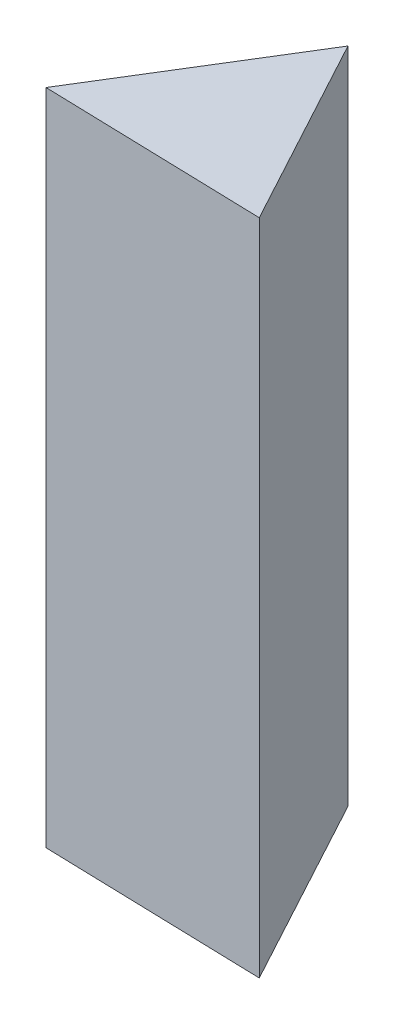
ISO-10303-21;
HEADER;
FILE_DESCRIPTION(('STEP AP214'),'2;1');
FILE_NAME('part.step','',(''),(''),'','','');
FILE_SCHEMA(('AUTOMOTIVE_DESIGN { 1 0 10303 214 1 1 1 1 }'));
ENDSEC;
DATA;
#1=APPLICATION_CONTEXT('core data for automotive mechanical design processes');
#2=APPLICATION_PROTOCOL_DEFINITION('international standard','automotive_design',2000,#1);
#3=PRODUCT_CONTEXT('',#1,'mechanical');
#4=PRODUCT('Part','Part','',(#3));
#5=PRODUCT_RELATED_PRODUCT_CATEGORY('part','',(#4));
#6=PRODUCT_DEFINITION_FORMATION('','',#4);
#7=PRODUCT_DEFINITION_CONTEXT('part definition',#1,'design');
#8=PRODUCT_DEFINITION('design','',#6,#7);
#9=PRODUCT_DEFINITION_SHAPE('','',#8);
#10=(LENGTH_UNIT() NAMED_UNIT(*) SI_UNIT(.MILLI.,.METRE.));
#11=(NAMED_UNIT(*) PLANE_ANGLE_UNIT() SI_UNIT($,.RADIAN.));
#12=(NAMED_UNIT(*) SI_UNIT($,.STERADIAN.) SOLID_ANGLE_UNIT());
#13=UNCERTAINTY_MEASURE_WITH_UNIT(LENGTH_MEASURE(1.E-05),#10,'distance_accuracy_value','');
#14=(GEOMETRIC_REPRESENTATION_CONTEXT(3) GLOBAL_UNCERTAINTY_ASSIGNED_CONTEXT((#13)) GLOBAL_UNIT_ASSIGNED_CONTEXT((#10,
#11,#12)) REPRESENTATION_CONTEXT('',''));
#15=CARTESIAN_POINT('',(0.,0.,0.));
#16=DIRECTION('',(0.,0.,1.));
#17=DIRECTION('',(1.,0.,0.));
#18=AXIS2_PLACEMENT_3D('',#15,#16,#17);
#19=CARTESIAN_POINT('',(-12.6975323008911,75.,6.86338158644562));
#20=DIRECTION('',(0.0280525263310692,0.,-0.999606450442595));
#21=DIRECTION('',(-0.999606450442595,0.,-0.0280525263310692));
#22=AXIS2_PLACEMENT_3D('',#19,#20,#21);
#23=PLANE('',#22);
#24=DIRECTION('',(0.999606450442595,0.,0.0280525263310692));
#25=VECTOR('',#24,1.);
#26=CARTESIAN_POINT('',(-12.6975323008911,0.,6.86338158644562));
#27=LINE('',#26,#25);
#28=CARTESIAN_POINT('',(-12.6975323008911,0.,6.86338158644562));
#29=VERTEX_POINT('',#28);
#30=CARTESIAN_POINT('',(12.2926289601738,0.,7.56469474472235));
#31=VERTEX_POINT('',#30);
#32=EDGE_CURVE('E82',#29,#31,#27,.T.);
#33=ORIENTED_EDGE('',*,*,#32,.T.);
#34=DIRECTION('',(0.,-1.,0.));
#35=VECTOR('',#34,1.);
#36=CARTESIAN_POINT('',(12.2926289601738,75.,7.56469474472235));
#37=LINE('',#36,#35);
#38=CARTESIAN_POINT('',(12.2926289601738,75.,7.56469474472235));
#39=VERTEX_POINT('',#38);
#40=EDGE_CURVE('E11',#39,#31,#37,.T.);
#41=ORIENTED_EDGE('',*,*,#40,.F.);
#42=DIRECTION('',(0.999606450442595,0.,0.0280525263310692));
#43=VECTOR('',#42,1.);
#44=CARTESIAN_POINT('',(-12.6975323008911,75.,6.86338158644562));
#45=LINE('',#44,#43);
#46=CARTESIAN_POINT('',(-12.6975323008911,75.,6.86338158644562));
#47=VERTEX_POINT('',#46);
#48=EDGE_CURVE('E75',#47,#39,#45,.T.);
#49=ORIENTED_EDGE('',*,*,#48,.F.);
#50=DIRECTION('',(0.,-1.,0.));
#51=VECTOR('',#50,1.);
#52=CARTESIAN_POINT('',(-12.6975323008911,75.,6.86338158644562));
#53=LINE('',#52,#51);
#54=EDGE_CURVE('E83',#47,#29,#53,.T.);
#55=ORIENTED_EDGE('',*,*,#54,.T.);
#56=EDGE_LOOP('',(#33,#41,#49,#55));
#57=FACE_BOUND('',#56,.T.);
#58=ADVANCED_FACE('F35',(#57),#23,.F.);
#59=CARTESIAN_POINT('',(12.2926289601738,75.,7.56469474472235));
#60=DIRECTION('',(-0.879710843035613,0.,0.47550902477826));
#61=DIRECTION('',(0.47550902477826,0.,0.879710843035613));
#62=AXIS2_PLACEMENT_3D('',#59,#60,#61);
#63=PLANE('',#62);
#64=DIRECTION('',(-0.47550902477826,0.,-0.879710843035613));
#65=VECTOR('',#64,1.);
#66=CARTESIAN_POINT('',(12.2926289601738,0.,7.56469474472235));
#67=LINE('',#66,#65);
#68=CARTESIAN_POINT('',(0.404903340717301,0.,-14.428076331168));
#69=VERTEX_POINT('',#68);
#70=EDGE_CURVE('E63',#31,#69,#67,.T.);
#71=ORIENTED_EDGE('',*,*,#70,.T.);
#72=DIRECTION('',(0.,-1.,0.));
#73=VECTOR('',#72,1.);
#74=CARTESIAN_POINT('',(0.404903340717301,75.,-14.428076331168));
#75=LINE('',#74,#73);
#76=CARTESIAN_POINT('',(0.404903340717301,75.,-14.428076331168));
#77=VERTEX_POINT('',#76);
#78=EDGE_CURVE('E43',#77,#69,#75,.T.);
#79=ORIENTED_EDGE('',*,*,#78,.F.);
#80=DIRECTION('',(-0.47550902477826,0.,-0.879710843035613));
#81=VECTOR('',#80,1.);
#82=CARTESIAN_POINT('',(12.2926289601738,75.,7.56469474472235));
#83=LINE('',#82,#81);
#84=EDGE_CURVE('E71',#39,#77,#83,.T.);
#85=ORIENTED_EDGE('',*,*,#84,.F.);
#86=ORIENTED_EDGE('',*,*,#40,.T.);
#87=EDGE_LOOP('',(#71,#79,#85,#86));
#88=FACE_BOUND('',#87,.T.);
#89=ADVANCED_FACE('F72',(#88),#63,.F.);
#90=CARTESIAN_POINT('',(0.404903340717301,75.,-14.428076331168));
#91=DIRECTION('',(0.851658316704543,0.,0.524097425664336));
#92=DIRECTION('',(0.524097425664336,0.,-0.851658316704543));
#93=AXIS2_PLACEMENT_3D('',#90,#91,#92);
#94=PLANE('',#93);
#95=DIRECTION('',(-0.524097425664336,0.,0.851658316704543));
#96=VECTOR('',#95,1.);
#97=CARTESIAN_POINT('',(0.404903340717301,0.,-14.428076331168));
#98=LINE('',#97,#96);
#99=EDGE_CURVE('E68',#69,#29,#98,.T.);
#100=ORIENTED_EDGE('',*,*,#99,.T.);
#101=ORIENTED_EDGE('',*,*,#54,.F.);
#102=DIRECTION('',(-0.524097425664336,0.,0.851658316704543));
#103=VECTOR('',#102,1.);
#104=CARTESIAN_POINT('',(0.404903340717301,75.,-14.428076331168));
#105=LINE('',#104,#103);
#106=EDGE_CURVE('E51',#77,#47,#105,.T.);
#107=ORIENTED_EDGE('',*,*,#106,.F.);
#108=ORIENTED_EDGE('',*,*,#78,.T.);
#109=EDGE_LOOP('',(#100,#101,#107,#108));
#110=FACE_BOUND('',#109,.T.);
#111=ADVANCED_FACE('F90',(#110),#94,.F.);
#112=CARTESIAN_POINT('',(0.,75.,0.));
#113=DIRECTION('',(0.,1.,0.));
#114=DIRECTION('',(0.,0.,1.));
#115=AXIS2_PLACEMENT_3D('',#112,#113,#114);
#116=PLANE('',#115);
#117=ORIENTED_EDGE('',*,*,#48,.T.);
#118=ORIENTED_EDGE('',*,*,#84,.T.);
#119=ORIENTED_EDGE('',*,*,#106,.T.);
#120=EDGE_LOOP('',(#117,#118,#119));
#121=FACE_BOUND('',#120,.T.);
#122=ADVANCED_FACE('F78',(#121),#116,.T.);
#123=CARTESIAN_POINT('',(0.,0.,0.));
#124=DIRECTION('',(0.,1.,0.));
#125=DIRECTION('',(0.,0.,1.));
#126=AXIS2_PLACEMENT_3D('',#123,#124,#125);
#127=PLANE('',#126);
#128=ORIENTED_EDGE('',*,*,#32,.F.);
#129=ORIENTED_EDGE('',*,*,#99,.F.);
#130=ORIENTED_EDGE('',*,*,#70,.F.);
#131=EDGE_LOOP('',(#128,#129,#130));
#132=FACE_BOUND('',#131,.T.);
#133=ADVANCED_FACE('F91',(#132),#127,.F.);
#134=CLOSED_SHELL('',(#58,#89,#111,#122,#133));
#135=MANIFOLD_SOLID_BREP('B2',#134);
#136=ADVANCED_BREP_SHAPE_REPRESENTATION('',(#18,#135),#14);
#137=SHAPE_DEFINITION_REPRESENTATION(#9,#136);
ENDSEC;
END-ISO-10303-21;
